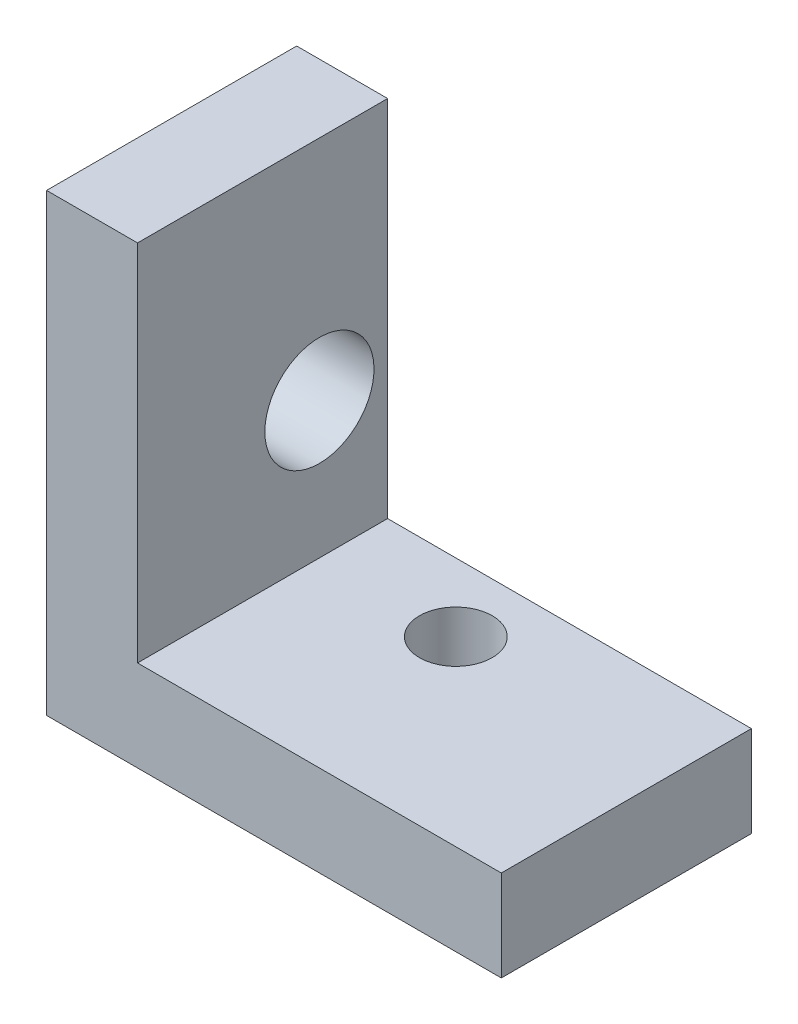
ISO-10303-21;
HEADER;
FILE_DESCRIPTION(('STEP AP214'),'2;1');
FILE_NAME('part.step','',(''),(''),'','','');
FILE_SCHEMA(('AUTOMOTIVE_DESIGN { 1 0 10303 214 1 1 1 1 }'));
ENDSEC;
DATA;
#1=APPLICATION_CONTEXT('core data for automotive mechanical design processes');
#2=APPLICATION_PROTOCOL_DEFINITION('international standard','automotive_design',2000,#1);
#3=PRODUCT_CONTEXT('',#1,'mechanical');
#4=PRODUCT('Part','Part','',(#3));
#5=PRODUCT_RELATED_PRODUCT_CATEGORY('part','',(#4));
#6=PRODUCT_DEFINITION_FORMATION('','',#4);
#7=PRODUCT_DEFINITION_CONTEXT('part definition',#1,'design');
#8=PRODUCT_DEFINITION('design','',#6,#7);
#9=PRODUCT_DEFINITION_SHAPE('','',#8);
#10=(LENGTH_UNIT() NAMED_UNIT(*) SI_UNIT(.MILLI.,.METRE.));
#11=(NAMED_UNIT(*) PLANE_ANGLE_UNIT() SI_UNIT($,.RADIAN.));
#12=(NAMED_UNIT(*) SI_UNIT($,.STERADIAN.) SOLID_ANGLE_UNIT());
#13=UNCERTAINTY_MEASURE_WITH_UNIT(LENGTH_MEASURE(1.E-05),#10,'distance_accuracy_value','');
#14=(GEOMETRIC_REPRESENTATION_CONTEXT(3) GLOBAL_UNCERTAINTY_ASSIGNED_CONTEXT((#13)) GLOBAL_UNIT_ASSIGNED_CONTEXT((#10,
#11,#12)) REPRESENTATION_CONTEXT('',''));
#15=CARTESIAN_POINT('',(0.,0.,0.));
#16=DIRECTION('',(0.,0.,1.));
#17=DIRECTION('',(1.,0.,0.));
#18=AXIS2_PLACEMENT_3D('',#15,#16,#17);
#19=CARTESIAN_POINT('',(0.,0.,5.5));
#20=DIRECTION('',(1.,0.,0.));
#21=DIRECTION('',(0.,0.,-1.));
#22=AXIS2_PLACEMENT_3D('',#19,#20,#21);
#23=PLANE('',#22);
#24=DIRECTION('',(0.,-1.,0.));
#25=VECTOR('',#24,1.);
#26=CARTESIAN_POINT('',(0.,0.,0.));
#27=LINE('',#26,#25);
#28=CARTESIAN_POINT('',(0.,10.,0.));
#29=VERTEX_POINT('',#28);
#30=CARTESIAN_POINT('',(0.,0.,0.));
#31=VERTEX_POINT('',#30);
#32=EDGE_CURVE('E89',#29,#31,#27,.T.);
#33=ORIENTED_EDGE('',*,*,#32,.T.);
#34=DIRECTION('',(0.,0.,-1.));
#35=VECTOR('',#34,1.);
#36=CARTESIAN_POINT('',(0.,0.,5.5));
#37=LINE('',#36,#35);
#38=CARTESIAN_POINT('',(0.,0.,5.5));
#39=VERTEX_POINT('',#38);
#40=EDGE_CURVE('E124',#39,#31,#37,.T.);
#41=ORIENTED_EDGE('',*,*,#40,.F.);
#42=DIRECTION('',(0.,-1.,0.));
#43=VECTOR('',#42,1.);
#44=CARTESIAN_POINT('',(0.,0.,5.5));
#45=LINE('',#44,#43);
#46=CARTESIAN_POINT('',(0.,10.,5.5));
#47=VERTEX_POINT('',#46);
#48=EDGE_CURVE('E60',#47,#39,#45,.T.);
#49=ORIENTED_EDGE('',*,*,#48,.F.);
#50=DIRECTION('',(0.,0.,-1.));
#51=VECTOR('',#50,1.);
#52=CARTESIAN_POINT('',(0.,10.,5.5));
#53=LINE('',#52,#51);
#54=EDGE_CURVE('E120',#47,#29,#53,.T.);
#55=ORIENTED_EDGE('',*,*,#54,.T.);
#56=EDGE_LOOP('',(#33,#41,#49,#55));
#57=FACE_BOUND('',#56,.T.);
#58=CARTESIAN_POINT('',(0.,5.,1.5));
#59=DIRECTION('',(-1.,0.,0.));
#60=DIRECTION('',(0.,0.,1.));
#61=AXIS2_PLACEMENT_3D('',#58,#59,#60);
#62=CIRCLE('',#61,1.225);
#63=CARTESIAN_POINT('',(0.,5.,2.725));
#64=VERTEX_POINT('',#63);
#65=EDGE_CURVE('E157',#64,#64,#62,.T.);
#66=ORIENTED_EDGE('',*,*,#65,.F.);
#67=EDGE_LOOP('',(#66));
#68=FACE_BOUND('',#67,.T.);
#69=ADVANCED_FACE('F43',(#57,#68),#23,.F.);
#70=CARTESIAN_POINT('',(10.,0.,5.5));
#71=DIRECTION('',(0.,1.,0.));
#72=DIRECTION('',(-1.,0.,0.));
#73=AXIS2_PLACEMENT_3D('',#70,#71,#72);
#74=PLANE('',#73);
#75=CARTESIAN_POINT('',(5.,0.,1.5));
#76=DIRECTION('',(0.,-1.,0.));
#77=DIRECTION('',(0.,0.,-1.));
#78=AXIS2_PLACEMENT_3D('',#75,#76,#77);
#79=CIRCLE('',#78,1.225);
#80=CARTESIAN_POINT('',(5.,0.,0.274999999999999));
#81=VERTEX_POINT('',#80);
#82=EDGE_CURVE('E167',#81,#81,#79,.T.);
#83=ORIENTED_EDGE('',*,*,#82,.F.);
#84=EDGE_LOOP('',(#83));
#85=FACE_BOUND('',#84,.T.);
#86=DIRECTION('',(1.,0.,0.));
#87=VECTOR('',#86,1.);
#88=CARTESIAN_POINT('',(10.,0.,0.));
#89=LINE('',#88,#87);
#90=CARTESIAN_POINT('',(10.,0.,0.));
#91=VERTEX_POINT('',#90);
#92=EDGE_CURVE('E128',#31,#91,#89,.T.);
#93=ORIENTED_EDGE('',*,*,#92,.T.);
#94=DIRECTION('',(0.,0.,-1.));
#95=VECTOR('',#94,1.);
#96=CARTESIAN_POINT('',(10.,0.,5.5));
#97=LINE('',#96,#95);
#98=CARTESIAN_POINT('',(10.,0.,5.5));
#99=VERTEX_POINT('',#98);
#100=EDGE_CURVE('E11',#99,#91,#97,.T.);
#101=ORIENTED_EDGE('',*,*,#100,.F.);
#102=DIRECTION('',(1.,0.,0.));
#103=VECTOR('',#102,1.);
#104=CARTESIAN_POINT('',(10.,0.,5.5));
#105=LINE('',#104,#103);
#106=EDGE_CURVE('E139',#39,#99,#105,.T.);
#107=ORIENTED_EDGE('',*,*,#106,.F.);
#108=ORIENTED_EDGE('',*,*,#40,.T.);
#109=EDGE_LOOP('',(#93,#101,#107,#108));
#110=FACE_BOUND('',#109,.T.);
#111=ADVANCED_FACE('F45',(#85,#110),#74,.F.);
#112=CARTESIAN_POINT('',(10.,2.,5.5));
#113=DIRECTION('',(-1.,0.,0.));
#114=DIRECTION('',(0.,0.,1.));
#115=AXIS2_PLACEMENT_3D('',#112,#113,#114);
#116=PLANE('',#115);
#117=DIRECTION('',(0.,1.,0.));
#118=VECTOR('',#117,1.);
#119=CARTESIAN_POINT('',(10.,2.,0.));
#120=LINE('',#119,#118);
#121=CARTESIAN_POINT('',(10.,2.,0.));
#122=VERTEX_POINT('',#121);
#123=EDGE_CURVE('E131',#91,#122,#120,.T.);
#124=ORIENTED_EDGE('',*,*,#123,.T.);
#125=DIRECTION('',(0.,0.,-1.));
#126=VECTOR('',#125,1.);
#127=CARTESIAN_POINT('',(10.,2.,5.5));
#128=LINE('',#127,#126);
#129=CARTESIAN_POINT('',(10.,2.,5.5));
#130=VERTEX_POINT('',#129);
#131=EDGE_CURVE('E52',#130,#122,#128,.T.);
#132=ORIENTED_EDGE('',*,*,#131,.F.);
#133=DIRECTION('',(0.,1.,0.));
#134=VECTOR('',#133,1.);
#135=CARTESIAN_POINT('',(10.,2.,5.5));
#136=LINE('',#135,#134);
#137=EDGE_CURVE('E97',#99,#130,#136,.T.);
#138=ORIENTED_EDGE('',*,*,#137,.F.);
#139=ORIENTED_EDGE('',*,*,#100,.T.);
#140=EDGE_LOOP('',(#124,#132,#138,#139));
#141=FACE_BOUND('',#140,.T.);
#142=ADVANCED_FACE('F193',(#141),#116,.F.);
#143=CARTESIAN_POINT('',(2.,2.,5.5));
#144=DIRECTION('',(0.,-1.,0.));
#145=DIRECTION('',(0.,0.,-1.));
#146=AXIS2_PLACEMENT_3D('',#143,#144,#145);
#147=PLANE('',#146);
#148=CARTESIAN_POINT('',(5.,2.,1.5));
#149=DIRECTION('',(0.,-1.,0.));
#150=DIRECTION('',(0.,0.,-1.));
#151=AXIS2_PLACEMENT_3D('',#148,#149,#150);
#152=CIRCLE('',#151,0.799999999999994);
#153=CARTESIAN_POINT('',(5.,2.,0.700000000000006));
#154=VERTEX_POINT('',#153);
#155=EDGE_CURVE('E132',#154,#154,#152,.T.);
#156=ORIENTED_EDGE('',*,*,#155,.T.);
#157=EDGE_LOOP('',(#156));
#158=FACE_BOUND('',#157,.T.);
#159=DIRECTION('',(-1.,0.,0.));
#160=VECTOR('',#159,1.);
#161=CARTESIAN_POINT('',(2.,2.,0.));
#162=LINE('',#161,#160);
#163=CARTESIAN_POINT('',(2.,2.,0.));
#164=VERTEX_POINT('',#163);
#165=EDGE_CURVE('E134',#122,#164,#162,.T.);
#166=ORIENTED_EDGE('',*,*,#165,.T.);
#167=DIRECTION('',(0.,0.,-1.));
#168=VECTOR('',#167,1.);
#169=CARTESIAN_POINT('',(2.,2.,5.5));
#170=LINE('',#169,#168);
#171=CARTESIAN_POINT('',(2.,2.,5.5));
#172=VERTEX_POINT('',#171);
#173=EDGE_CURVE('E119',#172,#164,#170,.T.);
#174=ORIENTED_EDGE('',*,*,#173,.F.);
#175=DIRECTION('',(-1.,0.,0.));
#176=VECTOR('',#175,1.);
#177=CARTESIAN_POINT('',(2.,2.,5.5));
#178=LINE('',#177,#176);
#179=EDGE_CURVE('E110',#130,#172,#178,.T.);
#180=ORIENTED_EDGE('',*,*,#179,.F.);
#181=ORIENTED_EDGE('',*,*,#131,.T.);
#182=EDGE_LOOP('',(#166,#174,#180,#181));
#183=FACE_BOUND('',#182,.T.);
#184=ADVANCED_FACE('F145',(#158,#183),#147,.F.);
#185=CARTESIAN_POINT('',(2.,10.,5.5));
#186=DIRECTION('',(-1.,0.,0.));
#187=DIRECTION('',(0.,-1.,0.));
#188=AXIS2_PLACEMENT_3D('',#185,#186,#187);
#189=PLANE('',#188);
#190=CARTESIAN_POINT('',(2.,5.,1.5));
#191=DIRECTION('',(-1.,0.,0.));
#192=DIRECTION('',(0.,-1.,0.));
#193=AXIS2_PLACEMENT_3D('',#190,#191,#192);
#194=CIRCLE('',#193,1.2);
#195=CARTESIAN_POINT('',(2.,3.8,1.5));
#196=VERTEX_POINT('',#195);
#197=EDGE_CURVE('E162',#196,#196,#194,.T.);
#198=ORIENTED_EDGE('',*,*,#197,.T.);
#199=EDGE_LOOP('',(#198));
#200=FACE_BOUND('',#199,.T.);
#201=DIRECTION('',(0.,1.,0.));
#202=VECTOR('',#201,1.);
#203=CARTESIAN_POINT('',(2.,10.,0.));
#204=LINE('',#203,#202);
#205=CARTESIAN_POINT('',(2.,10.,0.));
#206=VERTEX_POINT('',#205);
#207=EDGE_CURVE('E118',#164,#206,#204,.T.);
#208=ORIENTED_EDGE('',*,*,#207,.T.);
#209=DIRECTION('',(0.,0.,-1.));
#210=VECTOR('',#209,1.);
#211=CARTESIAN_POINT('',(2.,10.,5.5));
#212=LINE('',#211,#210);
#213=CARTESIAN_POINT('',(2.,10.,5.5));
#214=VERTEX_POINT('',#213);
#215=EDGE_CURVE('E115',#214,#206,#212,.T.);
#216=ORIENTED_EDGE('',*,*,#215,.F.);
#217=DIRECTION('',(0.,1.,0.));
#218=VECTOR('',#217,1.);
#219=CARTESIAN_POINT('',(2.,10.,5.5));
#220=LINE('',#219,#218);
#221=EDGE_CURVE('E104',#172,#214,#220,.T.);
#222=ORIENTED_EDGE('',*,*,#221,.F.);
#223=ORIENTED_EDGE('',*,*,#173,.T.);
#224=EDGE_LOOP('',(#208,#216,#222,#223));
#225=FACE_BOUND('',#224,.T.);
#226=ADVANCED_FACE('F116',(#200,#225),#189,.F.);
#227=CARTESIAN_POINT('',(0.,10.,5.5));
#228=DIRECTION('',(0.,-1.,0.));
#229=DIRECTION('',(0.,0.,-1.));
#230=AXIS2_PLACEMENT_3D('',#227,#228,#229);
#231=PLANE('',#230);
#232=DIRECTION('',(-1.,0.,0.));
#233=VECTOR('',#232,1.);
#234=CARTESIAN_POINT('',(0.,10.,0.));
#235=LINE('',#234,#233);
#236=EDGE_CURVE('E83',#206,#29,#235,.T.);
#237=ORIENTED_EDGE('',*,*,#236,.T.);
#238=ORIENTED_EDGE('',*,*,#54,.F.);
#239=DIRECTION('',(-1.,0.,0.));
#240=VECTOR('',#239,1.);
#241=CARTESIAN_POINT('',(0.,10.,5.5));
#242=LINE('',#241,#240);
#243=EDGE_CURVE('E108',#214,#47,#242,.T.);
#244=ORIENTED_EDGE('',*,*,#243,.F.);
#245=ORIENTED_EDGE('',*,*,#215,.T.);
#246=EDGE_LOOP('',(#237,#238,#244,#245));
#247=FACE_BOUND('',#246,.T.);
#248=ADVANCED_FACE('F122',(#247),#231,.F.);
#249=CARTESIAN_POINT('',(0.,0.,5.5));
#250=DIRECTION('',(0.,0.,-1.));
#251=DIRECTION('',(-1.,0.,0.));
#252=AXIS2_PLACEMENT_3D('',#249,#250,#251);
#253=PLANE('',#252);
#254=ORIENTED_EDGE('',*,*,#106,.T.);
#255=ORIENTED_EDGE('',*,*,#137,.T.);
#256=ORIENTED_EDGE('',*,*,#179,.T.);
#257=ORIENTED_EDGE('',*,*,#221,.T.);
#258=ORIENTED_EDGE('',*,*,#243,.T.);
#259=ORIENTED_EDGE('',*,*,#48,.T.);
#260=EDGE_LOOP('',(#254,#255,#256,#257,#258,#259));
#261=FACE_BOUND('',#260,.T.);
#262=ADVANCED_FACE('F106',(#261),#253,.F.);
#263=CARTESIAN_POINT('',(0.,0.,0.));
#264=DIRECTION('',(0.,0.,-1.));
#265=DIRECTION('',(-1.,0.,0.));
#266=AXIS2_PLACEMENT_3D('',#263,#264,#265);
#267=PLANE('',#266);
#268=ORIENTED_EDGE('',*,*,#92,.F.);
#269=ORIENTED_EDGE('',*,*,#32,.F.);
#270=ORIENTED_EDGE('',*,*,#236,.F.);
#271=ORIENTED_EDGE('',*,*,#207,.F.);
#272=ORIENTED_EDGE('',*,*,#165,.F.);
#273=ORIENTED_EDGE('',*,*,#123,.F.);
#274=EDGE_LOOP('',(#268,#269,#270,#271,#272,#273));
#275=FACE_BOUND('',#274,.T.);
#276=ADVANCED_FACE('F148',(#275),#267,.T.);
#277=CARTESIAN_POINT('',(5.,0.,1.5));
#278=DIRECTION('',(0.,-1.,0.));
#279=DIRECTION('',(0.,0.,-1.));
#280=AXIS2_PLACEMENT_3D('',#277,#278,#279);
#281=CYLINDRICAL_SURFACE('',#280,0.799999999999994);
#282=ORIENTED_EDGE('',*,*,#155,.F.);
#283=EDGE_LOOP('',(#282));
#284=FACE_BOUND('',#283,.T.);
#285=CARTESIAN_POINT('',(5.,0.425000000000008,1.5));
#286=DIRECTION('',(0.,-1.,0.));
#287=DIRECTION('',(0.,0.,-1.));
#288=AXIS2_PLACEMENT_3D('',#285,#286,#287);
#289=CIRCLE('',#288,0.799999999999988);
#290=CARTESIAN_POINT('',(5.,0.425000000000008,0.700000000000011));
#291=VERTEX_POINT('',#290);
#292=EDGE_CURVE('E170',#291,#291,#289,.T.);
#293=ORIENTED_EDGE('',*,*,#292,.T.);
#294=EDGE_LOOP('',(#293));
#295=FACE_BOUND('',#294,.T.);
#296=ADVANCED_FACE('F179',(#284,#295),#281,.F.);
#297=CARTESIAN_POINT('',(5.,0.,1.5));
#298=DIRECTION('',(0.,-1.,0.));
#299=DIRECTION('',(0.,0.,-1.));
#300=AXIS2_PLACEMENT_3D('',#297,#298,#299);
#301=CONICAL_SURFACE('',#300,1.225,0.78539816339745);
#302=ORIENTED_EDGE('',*,*,#292,.F.);
#303=EDGE_LOOP('',(#302));
#304=FACE_BOUND('',#303,.T.);
#305=ORIENTED_EDGE('',*,*,#82,.T.);
#306=EDGE_LOOP('',(#305));
#307=FACE_BOUND('',#306,.T.);
#308=ADVANCED_FACE('F182',(#304,#307),#301,.F.);
#309=CARTESIAN_POINT('',(0.,5.,1.5));
#310=DIRECTION('',(-1.,0.,0.));
#311=DIRECTION('',(0.,0.,1.));
#312=AXIS2_PLACEMENT_3D('',#309,#310,#311);
#313=CYLINDRICAL_SURFACE('',#312,1.2);
#314=ORIENTED_EDGE('',*,*,#197,.F.);
#315=EDGE_LOOP('',(#314));
#316=FACE_BOUND('',#315,.T.);
#317=CARTESIAN_POINT('',(0.0250000000000007,5.,1.5));
#318=DIRECTION('',(-1.,0.,0.));
#319=DIRECTION('',(0.,0.,1.));
#320=AXIS2_PLACEMENT_3D('',#317,#318,#319);
#321=CIRCLE('',#320,1.2);
#322=CARTESIAN_POINT('',(0.0250000000000007,5.,2.7));
#323=VERTEX_POINT('',#322);
#324=EDGE_CURVE('E159',#323,#323,#321,.T.);
#325=ORIENTED_EDGE('',*,*,#324,.T.);
#326=EDGE_LOOP('',(#325));
#327=FACE_BOUND('',#326,.T.);
#328=ADVANCED_FACE('F188',(#316,#327),#313,.F.);
#329=CARTESIAN_POINT('',(0.,5.,1.5));
#330=DIRECTION('',(-1.,0.,0.));
#331=DIRECTION('',(0.,0.,1.));
#332=AXIS2_PLACEMENT_3D('',#329,#330,#331);
#333=CONICAL_SURFACE('',#332,1.225,0.785398163397466);
#334=ORIENTED_EDGE('',*,*,#324,.F.);
#335=EDGE_LOOP('',(#334));
#336=FACE_BOUND('',#335,.T.);
#337=ORIENTED_EDGE('',*,*,#65,.T.);
#338=EDGE_LOOP('',(#337));
#339=FACE_BOUND('',#338,.T.);
#340=ADVANCED_FACE('F213',(#336,#339),#333,.F.);
#341=CLOSED_SHELL('',(#69,#111,#142,#184,#226,#248,#262,#276,#296,#308,#328,#340));
#342=MANIFOLD_SOLID_BREP('B2',#341);
#343=ADVANCED_BREP_SHAPE_REPRESENTATION('',(#18,#342),#14);
#344=SHAPE_DEFINITION_REPRESENTATION(#9,#343);
ENDSEC;
END-ISO-10303-21;
